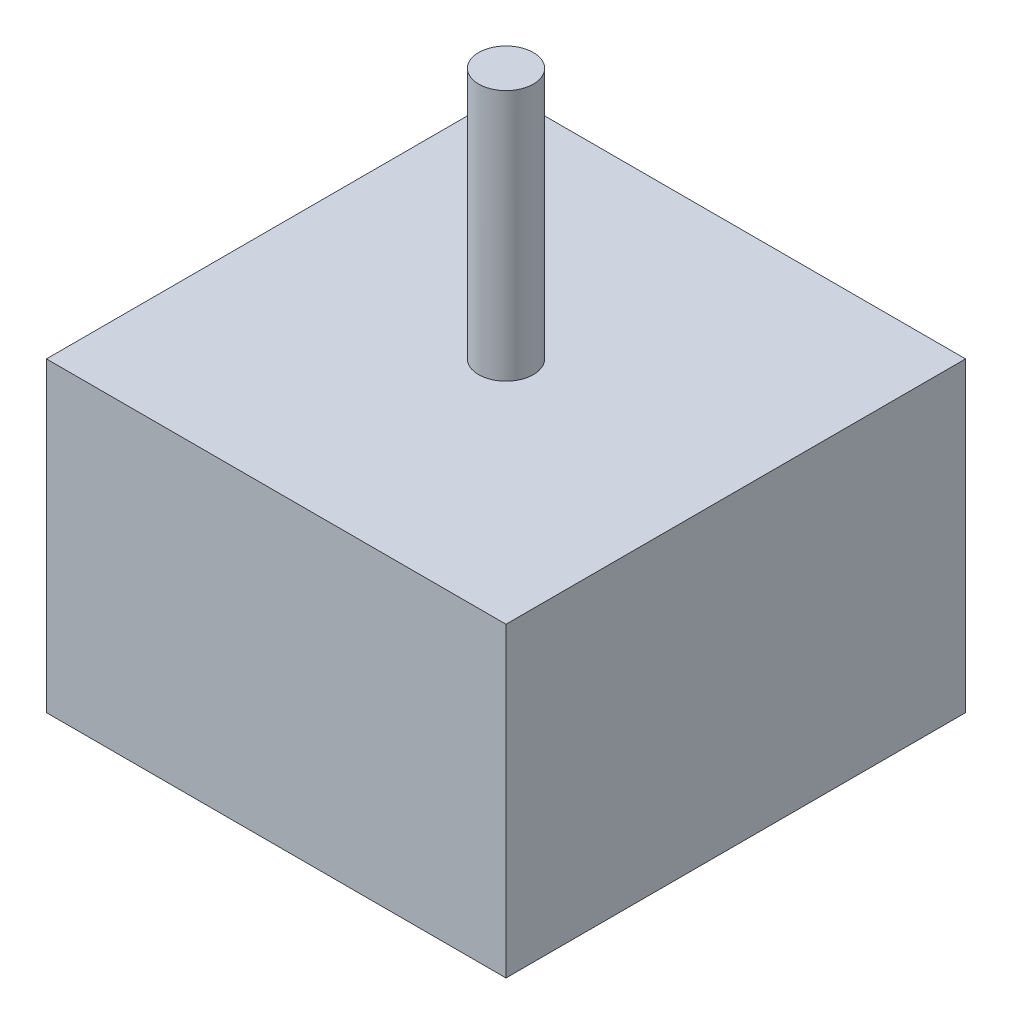
ISO-10303-21;
HEADER;
FILE_DESCRIPTION(('STEP AP214'),'2;1');
FILE_NAME('part.step','',(''),(''),'','','');
FILE_SCHEMA(('AUTOMOTIVE_DESIGN { 1 0 10303 214 1 1 1 1 }'));
ENDSEC;
DATA;
#1=APPLICATION_CONTEXT('core data for automotive mechanical design processes');
#2=APPLICATION_PROTOCOL_DEFINITION('international standard','automotive_design',2000,#1);
#3=PRODUCT_CONTEXT('',#1,'mechanical');
#4=PRODUCT('Part','Part','',(#3));
#5=PRODUCT_RELATED_PRODUCT_CATEGORY('part','',(#4));
#6=PRODUCT_DEFINITION_FORMATION('','',#4);
#7=PRODUCT_DEFINITION_CONTEXT('part definition',#1,'design');
#8=PRODUCT_DEFINITION('design','',#6,#7);
#9=PRODUCT_DEFINITION_SHAPE('','',#8);
#10=(LENGTH_UNIT() NAMED_UNIT(*) SI_UNIT(.MILLI.,.METRE.));
#11=(NAMED_UNIT(*) PLANE_ANGLE_UNIT() SI_UNIT($,.RADIAN.));
#12=(NAMED_UNIT(*) SI_UNIT($,.STERADIAN.) SOLID_ANGLE_UNIT());
#13=UNCERTAINTY_MEASURE_WITH_UNIT(LENGTH_MEASURE(1.E-05),#10,'distance_accuracy_value','');
#14=(GEOMETRIC_REPRESENTATION_CONTEXT(3) GLOBAL_UNCERTAINTY_ASSIGNED_CONTEXT((#13)) GLOBAL_UNIT_ASSIGNED_CONTEXT((#10,
#11,#12)) REPRESENTATION_CONTEXT('',''));
#15=CARTESIAN_POINT('',(0.,0.,0.));
#16=DIRECTION('',(0.,0.,1.));
#17=DIRECTION('',(1.,0.,0.));
#18=AXIS2_PLACEMENT_3D('',#15,#16,#17);
#19=CARTESIAN_POINT('',(42.,0.,0.));
#20=DIRECTION('',(0.,0.,-1.));
#21=DIRECTION('',(-1.,0.,0.));
#22=AXIS2_PLACEMENT_3D('',#19,#20,#21);
#23=PLANE('',#22);
#24=DIRECTION('',(0.,-1.,0.));
#25=VECTOR('',#24,1.);
#26=CARTESIAN_POINT('',(0.,0.,0.));
#27=LINE('',#26,#25);
#28=CARTESIAN_POINT('',(0.,28.,0.));
#29=VERTEX_POINT('',#28);
#30=CARTESIAN_POINT('',(0.,0.,0.));
#31=VERTEX_POINT('',#30);
#32=EDGE_CURVE('E116',#29,#31,#27,.T.);
#33=ORIENTED_EDGE('',*,*,#32,.T.);
#34=DIRECTION('',(-1.,0.,0.));
#35=VECTOR('',#34,1.);
#36=CARTESIAN_POINT('',(42.,0.,0.));
#37=LINE('',#36,#35);
#38=CARTESIAN_POINT('',(42.,0.,0.));
#39=VERTEX_POINT('',#38);
#40=EDGE_CURVE('E54',#39,#31,#37,.T.);
#41=ORIENTED_EDGE('',*,*,#40,.F.);
#42=DIRECTION('',(0.,-1.,0.));
#43=VECTOR('',#42,1.);
#44=CARTESIAN_POINT('',(42.,0.,0.));
#45=LINE('',#44,#43);
#46=CARTESIAN_POINT('',(42.,28.,0.));
#47=VERTEX_POINT('',#46);
#48=EDGE_CURVE('E98',#47,#39,#45,.T.);
#49=ORIENTED_EDGE('',*,*,#48,.F.);
#50=DIRECTION('',(-1.,0.,0.));
#51=VECTOR('',#50,1.);
#52=CARTESIAN_POINT('',(42.,28.,0.));
#53=LINE('',#52,#51);
#54=EDGE_CURVE('E112',#47,#29,#53,.T.);
#55=ORIENTED_EDGE('',*,*,#54,.T.);
#56=EDGE_LOOP('',(#33,#41,#49,#55));
#57=FACE_BOUND('',#56,.T.);
#58=ADVANCED_FACE('F45',(#57),#23,.F.);
#59=CARTESIAN_POINT('',(42.,0.,0.));
#60=DIRECTION('',(0.,1.,0.));
#61=DIRECTION('',(0.,0.,1.));
#62=AXIS2_PLACEMENT_3D('',#59,#60,#61);
#63=PLANE('',#62);
#64=DIRECTION('',(0.,0.,-1.));
#65=VECTOR('',#64,1.);
#66=CARTESIAN_POINT('',(0.,0.,0.));
#67=LINE('',#66,#65);
#68=CARTESIAN_POINT('',(0.,0.,-42.));
#69=VERTEX_POINT('',#68);
#70=EDGE_CURVE('E104',#31,#69,#67,.T.);
#71=ORIENTED_EDGE('',*,*,#70,.T.);
#72=DIRECTION('',(-1.,0.,0.));
#73=VECTOR('',#72,1.);
#74=CARTESIAN_POINT('',(42.,0.,-42.));
#75=LINE('',#74,#73);
#76=CARTESIAN_POINT('',(42.,0.,-42.));
#77=VERTEX_POINT('',#76);
#78=EDGE_CURVE('E102',#77,#69,#75,.T.);
#79=ORIENTED_EDGE('',*,*,#78,.F.);
#80=DIRECTION('',(0.,0.,-1.));
#81=VECTOR('',#80,1.);
#82=CARTESIAN_POINT('',(42.,0.,0.));
#83=LINE('',#82,#81);
#84=EDGE_CURVE('E93',#39,#77,#83,.T.);
#85=ORIENTED_EDGE('',*,*,#84,.F.);
#86=ORIENTED_EDGE('',*,*,#40,.T.);
#87=EDGE_LOOP('',(#71,#79,#85,#86));
#88=FACE_BOUND('',#87,.T.);
#89=ADVANCED_FACE('F103',(#88),#63,.F.);
#90=CARTESIAN_POINT('',(42.,0.,-42.));
#91=DIRECTION('',(0.,0.,1.));
#92=DIRECTION('',(1.,0.,0.));
#93=AXIS2_PLACEMENT_3D('',#90,#91,#92);
#94=PLANE('',#93);
#95=DIRECTION('',(0.,1.,0.));
#96=VECTOR('',#95,1.);
#97=CARTESIAN_POINT('',(0.,0.,-42.));
#98=LINE('',#97,#96);
#99=CARTESIAN_POINT('',(0.,28.,-42.));
#100=VERTEX_POINT('',#99);
#101=EDGE_CURVE('E79',#69,#100,#98,.T.);
#102=ORIENTED_EDGE('',*,*,#101,.T.);
#103=DIRECTION('',(-1.,0.,0.));
#104=VECTOR('',#103,1.);
#105=CARTESIAN_POINT('',(42.,28.,-42.));
#106=LINE('',#105,#104);
#107=CARTESIAN_POINT('',(42.,28.,-42.));
#108=VERTEX_POINT('',#107);
#109=EDGE_CURVE('E106',#108,#100,#106,.T.);
#110=ORIENTED_EDGE('',*,*,#109,.F.);
#111=DIRECTION('',(0.,1.,0.));
#112=VECTOR('',#111,1.);
#113=CARTESIAN_POINT('',(42.,0.,-42.));
#114=LINE('',#113,#112);
#115=EDGE_CURVE('E96',#77,#108,#114,.T.);
#116=ORIENTED_EDGE('',*,*,#115,.F.);
#117=ORIENTED_EDGE('',*,*,#78,.T.);
#118=EDGE_LOOP('',(#102,#110,#116,#117));
#119=FACE_BOUND('',#118,.T.);
#120=ADVANCED_FACE('F108',(#119),#94,.F.);
#121=CARTESIAN_POINT('',(42.,28.,0.));
#122=DIRECTION('',(0.,-1.,0.));
#123=DIRECTION('',(0.,0.,-1.));
#124=AXIS2_PLACEMENT_3D('',#121,#122,#123);
#125=PLANE('',#124);
#126=CARTESIAN_POINT('',(21.,28.,-21.));
#127=DIRECTION('',(0.,-1.,0.));
#128=DIRECTION('',(0.,0.,-1.));
#129=AXIS2_PLACEMENT_3D('',#126,#127,#128);
#130=CIRCLE('',#129,2.5);
#131=CARTESIAN_POINT('',(21.,28.,-23.5));
#132=VERTEX_POINT('',#131);
#133=EDGE_CURVE('E11',#132,#132,#130,.F.);
#134=ORIENTED_EDGE('',*,*,#133,.F.);
#135=EDGE_LOOP('',(#134));
#136=FACE_BOUND('',#135,.T.);
#137=DIRECTION('',(0.,0.,1.));
#138=VECTOR('',#137,1.);
#139=CARTESIAN_POINT('',(0.,28.,0.));
#140=LINE('',#139,#138);
#141=EDGE_CURVE('E85',#100,#29,#140,.T.);
#142=ORIENTED_EDGE('',*,*,#141,.T.);
#143=ORIENTED_EDGE('',*,*,#54,.F.);
#144=DIRECTION('',(0.,0.,1.));
#145=VECTOR('',#144,1.);
#146=CARTESIAN_POINT('',(42.,28.,0.));
#147=LINE('',#146,#145);
#148=EDGE_CURVE('E62',#108,#47,#147,.T.);
#149=ORIENTED_EDGE('',*,*,#148,.F.);
#150=ORIENTED_EDGE('',*,*,#109,.T.);
#151=EDGE_LOOP('',(#142,#143,#149,#150));
#152=FACE_BOUND('',#151,.T.);
#153=ADVANCED_FACE('F145',(#136,#152),#125,.F.);
#154=CARTESIAN_POINT('',(42.,0.,0.));
#155=DIRECTION('',(-1.,0.,0.));
#156=DIRECTION('',(0.,0.,1.));
#157=AXIS2_PLACEMENT_3D('',#154,#155,#156);
#158=PLANE('',#157);
#159=ORIENTED_EDGE('',*,*,#48,.T.);
#160=ORIENTED_EDGE('',*,*,#84,.T.);
#161=ORIENTED_EDGE('',*,*,#115,.T.);
#162=ORIENTED_EDGE('',*,*,#148,.T.);
#163=EDGE_LOOP('',(#159,#160,#161,#162));
#164=FACE_BOUND('',#163,.T.);
#165=ADVANCED_FACE('F94',(#164),#158,.F.);
#166=CARTESIAN_POINT('',(0.,0.,0.));
#167=DIRECTION('',(-1.,0.,0.));
#168=DIRECTION('',(0.,0.,1.));
#169=AXIS2_PLACEMENT_3D('',#166,#167,#168);
#170=PLANE('',#169);
#171=ORIENTED_EDGE('',*,*,#32,.F.);
#172=ORIENTED_EDGE('',*,*,#141,.F.);
#173=ORIENTED_EDGE('',*,*,#101,.F.);
#174=ORIENTED_EDGE('',*,*,#70,.F.);
#175=EDGE_LOOP('',(#171,#172,#173,#174));
#176=FACE_BOUND('',#175,.T.);
#177=ADVANCED_FACE('F134',(#176),#170,.T.);
#178=CARTESIAN_POINT('',(21.,51.,-21.));
#179=DIRECTION('',(0.,-1.,0.));
#180=DIRECTION('',(0.,0.,-1.));
#181=AXIS2_PLACEMENT_3D('',#178,#179,#180);
#182=CYLINDRICAL_SURFACE('',#181,2.5);
#183=CARTESIAN_POINT('',(21.,51.,-21.));
#184=DIRECTION('',(0.,1.,0.));
#185=DIRECTION('',(0.,0.,1.));
#186=AXIS2_PLACEMENT_3D('',#183,#184,#185);
#187=CIRCLE('',#186,2.5);
#188=CARTESIAN_POINT('',(21.,51.,-18.5));
#189=VERTEX_POINT('',#188);
#190=EDGE_CURVE('E120',#189,#189,#187,.T.);
#191=ORIENTED_EDGE('',*,*,#190,.F.);
#192=EDGE_LOOP('',(#191));
#193=FACE_BOUND('',#192,.T.);
#194=ORIENTED_EDGE('',*,*,#133,.T.);
#195=EDGE_LOOP('',(#194));
#196=FACE_BOUND('',#195,.T.);
#197=ADVANCED_FACE('F136',(#193,#196),#182,.T.);
#198=CARTESIAN_POINT('',(21.,51.,-21.));
#199=DIRECTION('',(0.,1.,0.));
#200=DIRECTION('',(0.,0.,1.));
#201=AXIS2_PLACEMENT_3D('',#198,#199,#200);
#202=PLANE('',#201);
#203=ORIENTED_EDGE('',*,*,#190,.T.);
#204=EDGE_LOOP('',(#203));
#205=FACE_BOUND('',#204,.T.);
#206=ADVANCED_FACE('F142',(#205),#202,.T.);
#207=CLOSED_SHELL('',(#58,#89,#120,#153,#165,#177,#197,#206));
#208=MANIFOLD_SOLID_BREP('B2',#207);
#209=ADVANCED_BREP_SHAPE_REPRESENTATION('',(#18,#208),#14);
#210=SHAPE_DEFINITION_REPRESENTATION(#9,#209);
ENDSEC;
END-ISO-10303-21;
